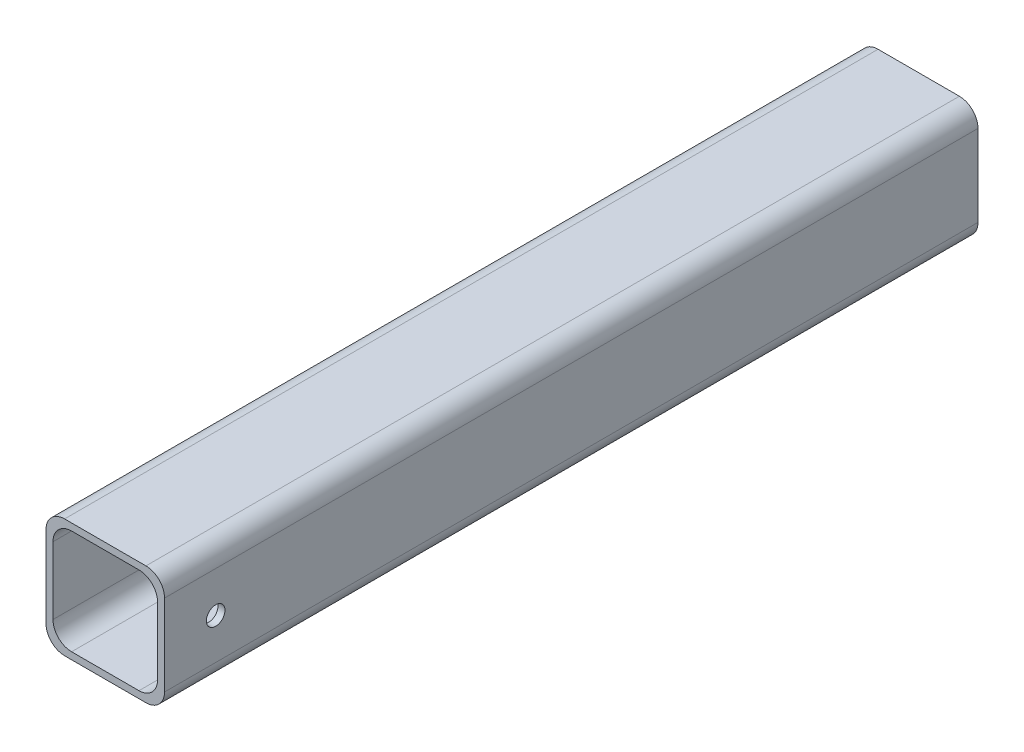
ISO-10303-21;
HEADER;
FILE_DESCRIPTION(('STEP AP214'),'2;1');
FILE_NAME('part.step','',(''),(''),'','','');
FILE_SCHEMA(('AUTOMOTIVE_DESIGN { 1 0 10303 214 1 1 1 1 }'));
ENDSEC;
DATA;
#1=APPLICATION_CONTEXT('core data for automotive mechanical design processes');
#2=APPLICATION_PROTOCOL_DEFINITION('international standard','automotive_design',2000,#1);
#3=PRODUCT_CONTEXT('',#1,'mechanical');
#4=PRODUCT('Part','Part','',(#3));
#5=PRODUCT_RELATED_PRODUCT_CATEGORY('part','',(#4));
#6=PRODUCT_DEFINITION_FORMATION('','',#4);
#7=PRODUCT_DEFINITION_CONTEXT('part definition',#1,'design');
#8=PRODUCT_DEFINITION('design','',#6,#7);
#9=PRODUCT_DEFINITION_SHAPE('','',#8);
#10=(LENGTH_UNIT() NAMED_UNIT(*) SI_UNIT(.MILLI.,.METRE.));
#11=(NAMED_UNIT(*) PLANE_ANGLE_UNIT() SI_UNIT($,.RADIAN.));
#12=(NAMED_UNIT(*) SI_UNIT($,.STERADIAN.) SOLID_ANGLE_UNIT());
#13=UNCERTAINTY_MEASURE_WITH_UNIT(LENGTH_MEASURE(1.E-05),#10,'distance_accuracy_value','');
#14=(GEOMETRIC_REPRESENTATION_CONTEXT(3) GLOBAL_UNCERTAINTY_ASSIGNED_CONTEXT((#13)) GLOBAL_UNIT_ASSIGNED_CONTEXT((#10,
#11,#12)) REPRESENTATION_CONTEXT('',''));
#15=CARTESIAN_POINT('',(0.,0.,0.));
#16=DIRECTION('',(0.,0.,1.));
#17=DIRECTION('',(1.,0.,0.));
#18=AXIS2_PLACEMENT_3D('',#15,#16,#17);
#19=CARTESIAN_POINT('',(0.,0.,175.));
#20=DIRECTION('',(0.,0.,-1.));
#21=DIRECTION('',(-1.,0.,0.));
#22=AXIS2_PLACEMENT_3D('',#19,#20,#21);
#23=PLANE('',#22);
#24=DIRECTION('',(-1.,0.,0.));
#25=VECTOR('',#24,1.);
#26=CARTESIAN_POINT('',(0.,25.5,175.));
#27=LINE('',#26,#25);
#28=CARTESIAN_POINT('',(21.5,25.5,175.));
#29=VERTEX_POINT('',#28);
#30=CARTESIAN_POINT('',(4.,25.5,175.));
#31=VERTEX_POINT('',#30);
#32=EDGE_CURVE('E189',#29,#31,#27,.T.);
#33=ORIENTED_EDGE('',*,*,#32,.T.);
#34=CARTESIAN_POINT('',(4.,21.5,175.));
#35=DIRECTION('',(0.,0.,-1.));
#36=DIRECTION('',(-1.,0.,0.));
#37=AXIS2_PLACEMENT_3D('',#34,#35,#36);
#38=CIRCLE('',#37,4.);
#39=CARTESIAN_POINT('',(0.,21.5,175.));
#40=VERTEX_POINT('',#39);
#41=EDGE_CURVE('E211',#31,#40,#38,.F.);
#42=ORIENTED_EDGE('',*,*,#41,.T.);
#43=DIRECTION('',(0.,-1.,0.));
#44=VECTOR('',#43,1.);
#45=CARTESIAN_POINT('',(0.,0.,175.));
#46=LINE('',#45,#44);
#47=CARTESIAN_POINT('',(0.,4.,175.));
#48=VERTEX_POINT('',#47);
#49=EDGE_CURVE('E172',#40,#48,#46,.T.);
#50=ORIENTED_EDGE('',*,*,#49,.T.);
#51=CARTESIAN_POINT('',(4.,4.,175.));
#52=DIRECTION('',(0.,0.,-1.));
#53=DIRECTION('',(-1.,0.,0.));
#54=AXIS2_PLACEMENT_3D('',#51,#52,#53);
#55=CIRCLE('',#54,4.);
#56=CARTESIAN_POINT('',(4.,0.,175.));
#57=VERTEX_POINT('',#56);
#58=EDGE_CURVE('E207',#48,#57,#55,.F.);
#59=ORIENTED_EDGE('',*,*,#58,.T.);
#60=DIRECTION('',(1.,0.,0.));
#61=VECTOR('',#60,1.);
#62=CARTESIAN_POINT('',(0.,0.,175.));
#63=LINE('',#62,#61);
#64=CARTESIAN_POINT('',(21.5,0.,175.));
#65=VERTEX_POINT('',#64);
#66=EDGE_CURVE('E290',#57,#65,#63,.T.);
#67=ORIENTED_EDGE('',*,*,#66,.T.);
#68=CARTESIAN_POINT('',(21.5,4.,175.));
#69=DIRECTION('',(0.,0.,-1.));
#70=DIRECTION('',(-1.,0.,0.));
#71=AXIS2_PLACEMENT_3D('',#68,#69,#70);
#72=CIRCLE('',#71,4.);
#73=CARTESIAN_POINT('',(25.5,4.,175.));
#74=VERTEX_POINT('',#73);
#75=EDGE_CURVE('E210',#65,#74,#72,.F.);
#76=ORIENTED_EDGE('',*,*,#75,.T.);
#77=DIRECTION('',(0.,1.,0.));
#78=VECTOR('',#77,1.);
#79=CARTESIAN_POINT('',(25.5,0.,175.));
#80=LINE('',#79,#78);
#81=CARTESIAN_POINT('',(25.5,21.5,175.));
#82=VERTEX_POINT('',#81);
#83=EDGE_CURVE('E289',#74,#82,#80,.T.);
#84=ORIENTED_EDGE('',*,*,#83,.T.);
#85=CARTESIAN_POINT('',(21.5,21.5,175.));
#86=DIRECTION('',(0.,0.,-1.));
#87=DIRECTION('',(-1.,0.,0.));
#88=AXIS2_PLACEMENT_3D('',#85,#86,#87);
#89=CIRCLE('',#88,4.);
#90=EDGE_CURVE('E202',#82,#29,#89,.F.);
#91=ORIENTED_EDGE('',*,*,#90,.T.);
#92=EDGE_LOOP('',(#33,#42,#50,#59,#67,#76,#84,#91));
#93=FACE_BOUND('',#92,.T.);
#94=DIRECTION('',(1.,0.,0.));
#95=VECTOR('',#94,1.);
#96=CARTESIAN_POINT('',(1.5,1.5,175.));
#97=LINE('',#96,#95);
#98=CARTESIAN_POINT('',(5.5,1.5,175.));
#99=VERTEX_POINT('',#98);
#100=CARTESIAN_POINT('',(20.,1.5,175.));
#101=VERTEX_POINT('',#100);
#102=EDGE_CURVE('E270',#99,#101,#97,.T.);
#103=ORIENTED_EDGE('',*,*,#102,.F.);
#104=CARTESIAN_POINT('',(5.5,5.5,175.));
#105=DIRECTION('',(0.,0.,-1.));
#106=DIRECTION('',(-1.,0.,0.));
#107=AXIS2_PLACEMENT_3D('',#104,#105,#106);
#108=CIRCLE('',#107,4.);
#109=CARTESIAN_POINT('',(1.5,5.5,175.));
#110=VERTEX_POINT('',#109);
#111=EDGE_CURVE('E253',#99,#110,#108,.T.);
#112=ORIENTED_EDGE('',*,*,#111,.T.);
#113=DIRECTION('',(0.,-1.,0.));
#114=VECTOR('',#113,1.);
#115=CARTESIAN_POINT('',(1.5,1.5,175.));
#116=LINE('',#115,#114);
#117=CARTESIAN_POINT('',(1.5,20.,175.));
#118=VERTEX_POINT('',#117);
#119=EDGE_CURVE('E182',#118,#110,#116,.T.);
#120=ORIENTED_EDGE('',*,*,#119,.F.);
#121=CARTESIAN_POINT('',(5.5,20.,175.));
#122=DIRECTION('',(0.,0.,-1.));
#123=DIRECTION('',(-1.,0.,0.));
#124=AXIS2_PLACEMENT_3D('',#121,#122,#123);
#125=CIRCLE('',#124,4.);
#126=CARTESIAN_POINT('',(5.5,24.,175.));
#127=VERTEX_POINT('',#126);
#128=EDGE_CURVE('E250',#118,#127,#125,.T.);
#129=ORIENTED_EDGE('',*,*,#128,.T.);
#130=DIRECTION('',(-1.,0.,0.));
#131=VECTOR('',#130,1.);
#132=CARTESIAN_POINT('',(1.5,24.,175.));
#133=LINE('',#132,#131);
#134=CARTESIAN_POINT('',(20.,24.,175.));
#135=VERTEX_POINT('',#134);
#136=EDGE_CURVE('E190',#135,#127,#133,.T.);
#137=ORIENTED_EDGE('',*,*,#136,.F.);
#138=CARTESIAN_POINT('',(20.,20.,175.));
#139=DIRECTION('',(0.,0.,-1.));
#140=DIRECTION('',(-1.,0.,0.));
#141=AXIS2_PLACEMENT_3D('',#138,#139,#140);
#142=CIRCLE('',#141,4.);
#143=CARTESIAN_POINT('',(24.,20.,175.));
#144=VERTEX_POINT('',#143);
#145=EDGE_CURVE('E53',#135,#144,#142,.T.);
#146=ORIENTED_EDGE('',*,*,#145,.T.);
#147=DIRECTION('',(0.,1.,0.));
#148=VECTOR('',#147,1.);
#149=CARTESIAN_POINT('',(24.,1.5,175.));
#150=LINE('',#149,#148);
#151=CARTESIAN_POINT('',(24.,5.5,175.));
#152=VERTEX_POINT('',#151);
#153=EDGE_CURVE('E267',#152,#144,#150,.T.);
#154=ORIENTED_EDGE('',*,*,#153,.F.);
#155=CARTESIAN_POINT('',(20.,5.5,175.));
#156=DIRECTION('',(0.,0.,-1.));
#157=DIRECTION('',(-1.,0.,0.));
#158=AXIS2_PLACEMENT_3D('',#155,#156,#157);
#159=CIRCLE('',#158,4.);
#160=EDGE_CURVE('E11',#152,#101,#159,.T.);
#161=ORIENTED_EDGE('',*,*,#160,.T.);
#162=EDGE_LOOP('',(#103,#112,#120,#129,#137,#146,#154,#161));
#163=FACE_BOUND('',#162,.T.);
#164=ADVANCED_FACE('F39',(#93,#163),#23,.F.);
#165=CARTESIAN_POINT('',(0.,0.,0.));
#166=DIRECTION('',(0.,0.,-1.));
#167=DIRECTION('',(-1.,0.,0.));
#168=AXIS2_PLACEMENT_3D('',#165,#166,#167);
#169=PLANE('',#168);
#170=DIRECTION('',(0.,-1.,0.));
#171=VECTOR('',#170,1.);
#172=CARTESIAN_POINT('',(0.,0.,0.));
#173=LINE('',#172,#171);
#174=CARTESIAN_POINT('',(0.,21.5,0.));
#175=VERTEX_POINT('',#174);
#176=CARTESIAN_POINT('',(0.,4.,0.));
#177=VERTEX_POINT('',#176);
#178=EDGE_CURVE('E168',#175,#177,#173,.T.);
#179=ORIENTED_EDGE('',*,*,#178,.F.);
#180=CARTESIAN_POINT('',(4.,21.5,0.));
#181=DIRECTION('',(0.,0.,-1.));
#182=DIRECTION('',(-1.,0.,0.));
#183=AXIS2_PLACEMENT_3D('',#180,#181,#182);
#184=CIRCLE('',#183,4.);
#185=CARTESIAN_POINT('',(4.,25.5,0.));
#186=VERTEX_POINT('',#185);
#187=EDGE_CURVE('E153',#175,#186,#184,.T.);
#188=ORIENTED_EDGE('',*,*,#187,.T.);
#189=DIRECTION('',(-1.,0.,0.));
#190=VECTOR('',#189,1.);
#191=CARTESIAN_POINT('',(0.,25.5,0.));
#192=LINE('',#191,#190);
#193=CARTESIAN_POINT('',(21.5,25.5,0.));
#194=VERTEX_POINT('',#193);
#195=EDGE_CURVE('E191',#194,#186,#192,.T.);
#196=ORIENTED_EDGE('',*,*,#195,.F.);
#197=CARTESIAN_POINT('',(21.5,21.5,0.));
#198=DIRECTION('',(0.,0.,-1.));
#199=DIRECTION('',(-1.,0.,0.));
#200=AXIS2_PLACEMENT_3D('',#197,#198,#199);
#201=CIRCLE('',#200,4.);
#202=CARTESIAN_POINT('',(25.5,21.5,0.));
#203=VERTEX_POINT('',#202);
#204=EDGE_CURVE('E173',#194,#203,#201,.T.);
#205=ORIENTED_EDGE('',*,*,#204,.T.);
#206=DIRECTION('',(0.,1.,0.));
#207=VECTOR('',#206,1.);
#208=CARTESIAN_POINT('',(25.5,0.,0.));
#209=LINE('',#208,#207);
#210=CARTESIAN_POINT('',(25.5,4.,0.));
#211=VERTEX_POINT('',#210);
#212=EDGE_CURVE('E184',#211,#203,#209,.T.);
#213=ORIENTED_EDGE('',*,*,#212,.F.);
#214=CARTESIAN_POINT('',(21.5,4.,0.));
#215=DIRECTION('',(0.,0.,-1.));
#216=DIRECTION('',(-1.,0.,0.));
#217=AXIS2_PLACEMENT_3D('',#214,#215,#216);
#218=CIRCLE('',#217,4.);
#219=CARTESIAN_POINT('',(21.5,0.,0.));
#220=VERTEX_POINT('',#219);
#221=EDGE_CURVE('E200',#211,#220,#218,.T.);
#222=ORIENTED_EDGE('',*,*,#221,.T.);
#223=DIRECTION('',(1.,0.,0.));
#224=VECTOR('',#223,1.);
#225=CARTESIAN_POINT('',(0.,0.,0.));
#226=LINE('',#225,#224);
#227=CARTESIAN_POINT('',(4.,0.,0.));
#228=VERTEX_POINT('',#227);
#229=EDGE_CURVE('E176',#228,#220,#226,.T.);
#230=ORIENTED_EDGE('',*,*,#229,.F.);
#231=CARTESIAN_POINT('',(4.,4.,0.));
#232=DIRECTION('',(0.,0.,-1.));
#233=DIRECTION('',(-1.,0.,0.));
#234=AXIS2_PLACEMENT_3D('',#231,#232,#233);
#235=CIRCLE('',#234,4.);
#236=EDGE_CURVE('E163',#228,#177,#235,.T.);
#237=ORIENTED_EDGE('',*,*,#236,.T.);
#238=EDGE_LOOP('',(#179,#188,#196,#205,#213,#222,#230,#237));
#239=FACE_BOUND('',#238,.T.);
#240=DIRECTION('',(-1.,0.,0.));
#241=VECTOR('',#240,1.);
#242=CARTESIAN_POINT('',(1.5,24.,0.));
#243=LINE('',#242,#241);
#244=CARTESIAN_POINT('',(20.,24.,0.));
#245=VERTEX_POINT('',#244);
#246=CARTESIAN_POINT('',(5.5,24.,0.));
#247=VERTEX_POINT('',#246);
#248=EDGE_CURVE('E265',#245,#247,#243,.T.);
#249=ORIENTED_EDGE('',*,*,#248,.T.);
#250=CARTESIAN_POINT('',(5.5,20.,0.));
#251=DIRECTION('',(0.,0.,-1.));
#252=DIRECTION('',(-1.,0.,0.));
#253=AXIS2_PLACEMENT_3D('',#250,#251,#252);
#254=CIRCLE('',#253,4.);
#255=CARTESIAN_POINT('',(1.5,20.,0.));
#256=VERTEX_POINT('',#255);
#257=EDGE_CURVE('E244',#247,#256,#254,.F.);
#258=ORIENTED_EDGE('',*,*,#257,.T.);
#259=DIRECTION('',(0.,-1.,0.));
#260=VECTOR('',#259,1.);
#261=CARTESIAN_POINT('',(1.5,1.5,0.));
#262=LINE('',#261,#260);
#263=CARTESIAN_POINT('',(1.5,5.5,0.));
#264=VERTEX_POINT('',#263);
#265=EDGE_CURVE('E272',#256,#264,#262,.T.);
#266=ORIENTED_EDGE('',*,*,#265,.T.);
#267=CARTESIAN_POINT('',(5.5,5.5,0.));
#268=DIRECTION('',(0.,0.,-1.));
#269=DIRECTION('',(-1.,0.,0.));
#270=AXIS2_PLACEMENT_3D('',#267,#268,#269);
#271=CIRCLE('',#270,4.);
#272=CARTESIAN_POINT('',(5.5,1.5,0.));
#273=VERTEX_POINT('',#272);
#274=EDGE_CURVE('E249',#264,#273,#271,.F.);
#275=ORIENTED_EDGE('',*,*,#274,.T.);
#276=DIRECTION('',(1.,0.,0.));
#277=VECTOR('',#276,1.);
#278=CARTESIAN_POINT('',(1.5,1.5,0.));
#279=LINE('',#278,#277);
#280=CARTESIAN_POINT('',(20.,1.5,0.));
#281=VERTEX_POINT('',#280);
#282=EDGE_CURVE('E260',#273,#281,#279,.T.);
#283=ORIENTED_EDGE('',*,*,#282,.T.);
#284=CARTESIAN_POINT('',(20.,5.5,0.));
#285=DIRECTION('',(0.,0.,-1.));
#286=DIRECTION('',(-1.,0.,0.));
#287=AXIS2_PLACEMENT_3D('',#284,#285,#286);
#288=CIRCLE('',#287,4.);
#289=CARTESIAN_POINT('',(24.,5.5,0.));
#290=VERTEX_POINT('',#289);
#291=EDGE_CURVE('E50',#281,#290,#288,.F.);
#292=ORIENTED_EDGE('',*,*,#291,.T.);
#293=DIRECTION('',(0.,1.,0.));
#294=VECTOR('',#293,1.);
#295=CARTESIAN_POINT('',(24.,1.5,0.));
#296=LINE('',#295,#294);
#297=CARTESIAN_POINT('',(24.,20.,0.));
#298=VERTEX_POINT('',#297);
#299=EDGE_CURVE('E254',#290,#298,#296,.T.);
#300=ORIENTED_EDGE('',*,*,#299,.T.);
#301=CARTESIAN_POINT('',(20.,20.,0.));
#302=DIRECTION('',(0.,0.,-1.));
#303=DIRECTION('',(-1.,0.,0.));
#304=AXIS2_PLACEMENT_3D('',#301,#302,#303);
#305=CIRCLE('',#304,4.);
#306=EDGE_CURVE('E245',#298,#245,#305,.F.);
#307=ORIENTED_EDGE('',*,*,#306,.T.);
#308=EDGE_LOOP('',(#249,#258,#266,#275,#283,#292,#300,#307));
#309=FACE_BOUND('',#308,.T.);
#310=ADVANCED_FACE('F180',(#239,#309),#169,.T.);
#311=CARTESIAN_POINT('',(0.,0.,175.));
#312=DIRECTION('',(1.,0.,0.));
#313=DIRECTION('',(0.,0.,-1.));
#314=AXIS2_PLACEMENT_3D('',#311,#312,#313);
#315=PLANE('',#314);
#316=ORIENTED_EDGE('',*,*,#49,.F.);
#317=DIRECTION('',(0.,0.,-1.));
#318=VECTOR('',#317,1.);
#319=CARTESIAN_POINT('',(0.,21.5,175.));
#320=LINE('',#319,#318);
#321=EDGE_CURVE('E160',#40,#175,#320,.T.);
#322=ORIENTED_EDGE('',*,*,#321,.T.);
#323=ORIENTED_EDGE('',*,*,#178,.T.);
#324=DIRECTION('',(0.,0.,-1.));
#325=VECTOR('',#324,1.);
#326=CARTESIAN_POINT('',(0.,4.,175.));
#327=LINE('',#326,#325);
#328=EDGE_CURVE('E174',#177,#48,#327,.F.);
#329=ORIENTED_EDGE('',*,*,#328,.T.);
#330=EDGE_LOOP('',(#316,#322,#323,#329));
#331=FACE_BOUND('',#330,.T.);
#332=ADVANCED_FACE('F166',(#331),#315,.F.);
#333=CARTESIAN_POINT('',(0.,0.,175.));
#334=DIRECTION('',(0.,1.,0.));
#335=DIRECTION('',(0.,0.,1.));
#336=AXIS2_PLACEMENT_3D('',#333,#334,#335);
#337=PLANE('',#336);
#338=ORIENTED_EDGE('',*,*,#66,.F.);
#339=DIRECTION('',(0.,0.,-1.));
#340=VECTOR('',#339,1.);
#341=CARTESIAN_POINT('',(4.,0.,175.));
#342=LINE('',#341,#340);
#343=EDGE_CURVE('E214',#57,#228,#342,.T.);
#344=ORIENTED_EDGE('',*,*,#343,.T.);
#345=ORIENTED_EDGE('',*,*,#229,.T.);
#346=DIRECTION('',(0.,0.,-1.));
#347=VECTOR('',#346,1.);
#348=CARTESIAN_POINT('',(21.5,0.,175.));
#349=LINE('',#348,#347);
#350=EDGE_CURVE('E213',#220,#65,#349,.F.);
#351=ORIENTED_EDGE('',*,*,#350,.T.);
#352=EDGE_LOOP('',(#338,#344,#345,#351));
#353=FACE_BOUND('',#352,.T.);
#354=ADVANCED_FACE('F315',(#353),#337,.F.);
#355=CARTESIAN_POINT('',(25.5,0.,175.));
#356=DIRECTION('',(-1.,0.,0.));
#357=DIRECTION('',(0.,0.,1.));
#358=AXIS2_PLACEMENT_3D('',#355,#356,#357);
#359=PLANE('',#358);
#360=CARTESIAN_POINT('',(25.5,12.75,164.));
#361=DIRECTION('',(1.,0.,0.));
#362=DIRECTION('',(0.,0.,-1.));
#363=AXIS2_PLACEMENT_3D('',#360,#361,#362);
#364=CIRCLE('',#363,2.);
#365=CARTESIAN_POINT('',(25.5,12.75,162.));
#366=VERTEX_POINT('',#365);
#367=EDGE_CURVE('E495',#366,#366,#364,.T.);
#368=ORIENTED_EDGE('',*,*,#367,.F.);
#369=EDGE_LOOP('',(#368));
#370=FACE_BOUND('',#369,.T.);
#371=ORIENTED_EDGE('',*,*,#83,.F.);
#372=DIRECTION('',(0.,0.,-1.));
#373=VECTOR('',#372,1.);
#374=CARTESIAN_POINT('',(25.5,4.,175.));
#375=LINE('',#374,#373);
#376=EDGE_CURVE('E219',#74,#211,#375,.T.);
#377=ORIENTED_EDGE('',*,*,#376,.T.);
#378=ORIENTED_EDGE('',*,*,#212,.T.);
#379=DIRECTION('',(0.,0.,-1.));
#380=VECTOR('',#379,1.);
#381=CARTESIAN_POINT('',(25.5,21.5,175.));
#382=LINE('',#381,#380);
#383=EDGE_CURVE('E217',#203,#82,#382,.F.);
#384=ORIENTED_EDGE('',*,*,#383,.T.);
#385=EDGE_LOOP('',(#371,#377,#378,#384));
#386=FACE_BOUND('',#385,.T.);
#387=ADVANCED_FACE('F304',(#370,#386),#359,.F.);
#388=CARTESIAN_POINT('',(0.,25.5,175.));
#389=DIRECTION('',(0.,-1.,0.));
#390=DIRECTION('',(0.,0.,-1.));
#391=AXIS2_PLACEMENT_3D('',#388,#389,#390);
#392=PLANE('',#391);
#393=ORIENTED_EDGE('',*,*,#195,.T.);
#394=DIRECTION('',(0.,0.,-1.));
#395=VECTOR('',#394,1.);
#396=CARTESIAN_POINT('',(4.,25.5,175.));
#397=LINE('',#396,#395);
#398=EDGE_CURVE('E158',#186,#31,#397,.F.);
#399=ORIENTED_EDGE('',*,*,#398,.T.);
#400=ORIENTED_EDGE('',*,*,#32,.F.);
#401=DIRECTION('',(0.,0.,-1.));
#402=VECTOR('',#401,1.);
#403=CARTESIAN_POINT('',(21.5,25.5,175.));
#404=LINE('',#403,#402);
#405=EDGE_CURVE('E162',#29,#194,#404,.T.);
#406=ORIENTED_EDGE('',*,*,#405,.T.);
#407=EDGE_LOOP('',(#393,#399,#400,#406));
#408=FACE_BOUND('',#407,.T.);
#409=ADVANCED_FACE('F297',(#408),#392,.F.);
#410=CARTESIAN_POINT('',(1.5,1.5,175.));
#411=DIRECTION('',(0.,1.,0.));
#412=DIRECTION('',(0.,0.,1.));
#413=AXIS2_PLACEMENT_3D('',#410,#411,#412);
#414=PLANE('',#413);
#415=ORIENTED_EDGE('',*,*,#282,.F.);
#416=DIRECTION('',(0.,0.,-1.));
#417=VECTOR('',#416,1.);
#418=CARTESIAN_POINT('',(5.5,1.5,175.));
#419=LINE('',#418,#417);
#420=EDGE_CURVE('E238',#273,#99,#419,.F.);
#421=ORIENTED_EDGE('',*,*,#420,.T.);
#422=ORIENTED_EDGE('',*,*,#102,.T.);
#423=DIRECTION('',(0.,0.,-1.));
#424=VECTOR('',#423,1.);
#425=CARTESIAN_POINT('',(20.,1.5,0.));
#426=LINE('',#425,#424);
#427=EDGE_CURVE('E240',#101,#281,#426,.T.);
#428=ORIENTED_EDGE('',*,*,#427,.T.);
#429=EDGE_LOOP('',(#415,#421,#422,#428));
#430=FACE_BOUND('',#429,.T.);
#431=ADVANCED_FACE('F271',(#430),#414,.T.);
#432=CARTESIAN_POINT('',(24.,1.5,175.));
#433=DIRECTION('',(-1.,0.,0.));
#434=DIRECTION('',(0.,0.,1.));
#435=AXIS2_PLACEMENT_3D('',#432,#433,#434);
#436=PLANE('',#435);
#437=CARTESIAN_POINT('',(24.,12.75,164.));
#438=DIRECTION('',(-1.,0.,0.));
#439=DIRECTION('',(0.,0.,1.));
#440=AXIS2_PLACEMENT_3D('',#437,#438,#439);
#441=CIRCLE('',#440,2.);
#442=CARTESIAN_POINT('',(24.,12.75,166.));
#443=VERTEX_POINT('',#442);
#444=EDGE_CURVE('E276',#443,#443,#441,.F.);
#445=ORIENTED_EDGE('',*,*,#444,.T.);
#446=EDGE_LOOP('',(#445));
#447=FACE_BOUND('',#446,.T.);
#448=ORIENTED_EDGE('',*,*,#153,.T.);
#449=DIRECTION('',(0.,0.,-1.));
#450=VECTOR('',#449,1.);
#451=CARTESIAN_POINT('',(24.,20.,0.));
#452=LINE('',#451,#450);
#453=EDGE_CURVE('E221',#144,#298,#452,.T.);
#454=ORIENTED_EDGE('',*,*,#453,.T.);
#455=ORIENTED_EDGE('',*,*,#299,.F.);
#456=DIRECTION('',(0.,0.,-1.));
#457=VECTOR('',#456,1.);
#458=CARTESIAN_POINT('',(24.,5.5,175.));
#459=LINE('',#458,#457);
#460=EDGE_CURVE('E61',#290,#152,#459,.F.);
#461=ORIENTED_EDGE('',*,*,#460,.T.);
#462=EDGE_LOOP('',(#448,#454,#455,#461));
#463=FACE_BOUND('',#462,.T.);
#464=ADVANCED_FACE('F257',(#447,#463),#436,.T.);
#465=CARTESIAN_POINT('',(1.5,24.,175.));
#466=DIRECTION('',(0.,-1.,0.));
#467=DIRECTION('',(0.,0.,-1.));
#468=AXIS2_PLACEMENT_3D('',#465,#466,#467);
#469=PLANE('',#468);
#470=ORIENTED_EDGE('',*,*,#248,.F.);
#471=DIRECTION('',(0.,0.,-1.));
#472=VECTOR('',#471,1.);
#473=CARTESIAN_POINT('',(20.,24.,175.));
#474=LINE('',#473,#472);
#475=EDGE_CURVE('E229',#245,#135,#474,.F.);
#476=ORIENTED_EDGE('',*,*,#475,.T.);
#477=ORIENTED_EDGE('',*,*,#136,.T.);
#478=DIRECTION('',(0.,0.,-1.));
#479=VECTOR('',#478,1.);
#480=CARTESIAN_POINT('',(5.5,24.,0.));
#481=LINE('',#480,#479);
#482=EDGE_CURVE('E230',#127,#247,#481,.T.);
#483=ORIENTED_EDGE('',*,*,#482,.T.);
#484=EDGE_LOOP('',(#470,#476,#477,#483));
#485=FACE_BOUND('',#484,.T.);
#486=ADVANCED_FACE('F376',(#485),#469,.T.);
#487=CARTESIAN_POINT('',(1.5,1.5,175.));
#488=DIRECTION('',(1.,0.,0.));
#489=DIRECTION('',(0.,0.,-1.));
#490=AXIS2_PLACEMENT_3D('',#487,#488,#489);
#491=PLANE('',#490);
#492=ORIENTED_EDGE('',*,*,#265,.F.);
#493=DIRECTION('',(0.,0.,-1.));
#494=VECTOR('',#493,1.);
#495=CARTESIAN_POINT('',(1.5,20.,175.));
#496=LINE('',#495,#494);
#497=EDGE_CURVE('E231',#256,#118,#496,.F.);
#498=ORIENTED_EDGE('',*,*,#497,.T.);
#499=ORIENTED_EDGE('',*,*,#119,.T.);
#500=DIRECTION('',(0.,0.,-1.));
#501=VECTOR('',#500,1.);
#502=CARTESIAN_POINT('',(1.5,5.5,0.));
#503=LINE('',#502,#501);
#504=EDGE_CURVE('E235',#110,#264,#503,.T.);
#505=ORIENTED_EDGE('',*,*,#504,.T.);
#506=EDGE_LOOP('',(#492,#498,#499,#505));
#507=FACE_BOUND('',#506,.T.);
#508=ADVANCED_FACE('F383',(#507),#491,.T.);
#509=CARTESIAN_POINT('',(18.3431457505076,12.75,164.));
#510=DIRECTION('',(1.,0.,0.));
#511=DIRECTION('',(0.,0.,-1.));
#512=AXIS2_PLACEMENT_3D('',#509,#510,#511);
#513=CYLINDRICAL_SURFACE('',#512,2.);
#514=ORIENTED_EDGE('',*,*,#367,.T.);
#515=EDGE_LOOP('',(#514));
#516=FACE_BOUND('',#515,.T.);
#517=ORIENTED_EDGE('',*,*,#444,.F.);
#518=EDGE_LOOP('',(#517));
#519=FACE_BOUND('',#518,.T.);
#520=ADVANCED_FACE('F322',(#516,#519),#513,.F.);
#521=CARTESIAN_POINT('',(4.,21.5,175.));
#522=DIRECTION('',(0.,0.,-1.));
#523=DIRECTION('',(-1.,0.,0.));
#524=AXIS2_PLACEMENT_3D('',#521,#522,#523);
#525=CYLINDRICAL_SURFACE('',#524,4.);
#526=ORIENTED_EDGE('',*,*,#41,.F.);
#527=ORIENTED_EDGE('',*,*,#398,.F.);
#528=ORIENTED_EDGE('',*,*,#187,.F.);
#529=ORIENTED_EDGE('',*,*,#321,.F.);
#530=EDGE_LOOP('',(#526,#527,#528,#529));
#531=FACE_BOUND('',#530,.T.);
#532=ADVANCED_FACE('F156',(#531),#525,.T.);
#533=CARTESIAN_POINT('',(4.,4.,175.));
#534=DIRECTION('',(0.,0.,-1.));
#535=DIRECTION('',(-1.,0.,0.));
#536=AXIS2_PLACEMENT_3D('',#533,#534,#535);
#537=CYLINDRICAL_SURFACE('',#536,4.);
#538=ORIENTED_EDGE('',*,*,#58,.F.);
#539=ORIENTED_EDGE('',*,*,#328,.F.);
#540=ORIENTED_EDGE('',*,*,#236,.F.);
#541=ORIENTED_EDGE('',*,*,#343,.F.);
#542=EDGE_LOOP('',(#538,#539,#540,#541));
#543=FACE_BOUND('',#542,.T.);
#544=ADVANCED_FACE('F316',(#543),#537,.T.);
#545=CARTESIAN_POINT('',(21.5,4.,175.));
#546=DIRECTION('',(0.,0.,-1.));
#547=DIRECTION('',(-1.,0.,0.));
#548=AXIS2_PLACEMENT_3D('',#545,#546,#547);
#549=CYLINDRICAL_SURFACE('',#548,4.);
#550=ORIENTED_EDGE('',*,*,#75,.F.);
#551=ORIENTED_EDGE('',*,*,#350,.F.);
#552=ORIENTED_EDGE('',*,*,#221,.F.);
#553=ORIENTED_EDGE('',*,*,#376,.F.);
#554=EDGE_LOOP('',(#550,#551,#552,#553));
#555=FACE_BOUND('',#554,.T.);
#556=ADVANCED_FACE('F306',(#555),#549,.T.);
#557=CARTESIAN_POINT('',(21.5,21.5,175.));
#558=DIRECTION('',(0.,0.,-1.));
#559=DIRECTION('',(-1.,0.,0.));
#560=AXIS2_PLACEMENT_3D('',#557,#558,#559);
#561=CYLINDRICAL_SURFACE('',#560,4.);
#562=ORIENTED_EDGE('',*,*,#90,.F.);
#563=ORIENTED_EDGE('',*,*,#383,.F.);
#564=ORIENTED_EDGE('',*,*,#204,.F.);
#565=ORIENTED_EDGE('',*,*,#405,.F.);
#566=EDGE_LOOP('',(#562,#563,#564,#565));
#567=FACE_BOUND('',#566,.T.);
#568=ADVANCED_FACE('F299',(#567),#561,.T.);
#569=CARTESIAN_POINT('',(20.,20.,175.));
#570=DIRECTION('',(0.,0.,1.));
#571=DIRECTION('',(1.,0.,0.));
#572=AXIS2_PLACEMENT_3D('',#569,#570,#571);
#573=CYLINDRICAL_SURFACE('',#572,4.);
#574=ORIENTED_EDGE('',*,*,#145,.F.);
#575=ORIENTED_EDGE('',*,*,#475,.F.);
#576=ORIENTED_EDGE('',*,*,#306,.F.);
#577=ORIENTED_EDGE('',*,*,#453,.F.);
#578=EDGE_LOOP('',(#574,#575,#576,#577));
#579=FACE_BOUND('',#578,.T.);
#580=ADVANCED_FACE('F421',(#579),#573,.F.);
#581=CARTESIAN_POINT('',(5.5,20.,175.));
#582=DIRECTION('',(0.,0.,1.));
#583=DIRECTION('',(1.,0.,0.));
#584=AXIS2_PLACEMENT_3D('',#581,#582,#583);
#585=CYLINDRICAL_SURFACE('',#584,4.);
#586=ORIENTED_EDGE('',*,*,#128,.F.);
#587=ORIENTED_EDGE('',*,*,#497,.F.);
#588=ORIENTED_EDGE('',*,*,#257,.F.);
#589=ORIENTED_EDGE('',*,*,#482,.F.);
#590=EDGE_LOOP('',(#586,#587,#588,#589));
#591=FACE_BOUND('',#590,.T.);
#592=ADVANCED_FACE('F435',(#591),#585,.F.);
#593=CARTESIAN_POINT('',(5.5,5.5,175.));
#594=DIRECTION('',(0.,0.,1.));
#595=DIRECTION('',(1.,0.,0.));
#596=AXIS2_PLACEMENT_3D('',#593,#594,#595);
#597=CYLINDRICAL_SURFACE('',#596,4.);
#598=ORIENTED_EDGE('',*,*,#111,.F.);
#599=ORIENTED_EDGE('',*,*,#420,.F.);
#600=ORIENTED_EDGE('',*,*,#274,.F.);
#601=ORIENTED_EDGE('',*,*,#504,.F.);
#602=EDGE_LOOP('',(#598,#599,#600,#601));
#603=FACE_BOUND('',#602,.T.);
#604=ADVANCED_FACE('F445',(#603),#597,.F.);
#605=CARTESIAN_POINT('',(20.,5.5,175.));
#606=DIRECTION('',(0.,0.,1.));
#607=DIRECTION('',(1.,0.,0.));
#608=AXIS2_PLACEMENT_3D('',#605,#606,#607);
#609=CYLINDRICAL_SURFACE('',#608,4.);
#610=ORIENTED_EDGE('',*,*,#160,.F.);
#611=ORIENTED_EDGE('',*,*,#460,.F.);
#612=ORIENTED_EDGE('',*,*,#291,.F.);
#613=ORIENTED_EDGE('',*,*,#427,.F.);
#614=EDGE_LOOP('',(#610,#611,#612,#613));
#615=FACE_BOUND('',#614,.T.);
#616=ADVANCED_FACE('F41',(#615),#609,.F.);
#617=CLOSED_SHELL('',(#164,#310,#332,#354,#387,#409,#431,#464,#486,#508,#520,#532,#544,#556,
#568,#580,#592,#604,#616));
#618=MANIFOLD_SOLID_BREP('B2',#617);
#619=ADVANCED_BREP_SHAPE_REPRESENTATION('',(#18,#618),#14);
#620=SHAPE_DEFINITION_REPRESENTATION(#9,#619);
ENDSEC;
END-ISO-10303-21;
